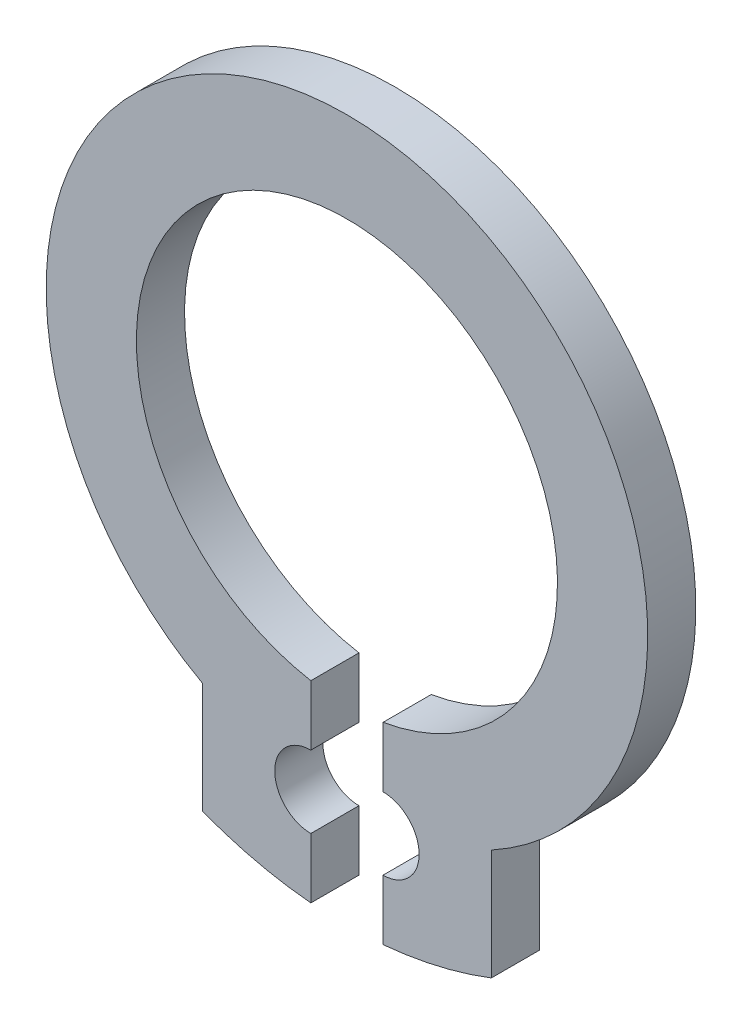
ISO-10303-21;
HEADER;
FILE_DESCRIPTION(('STEP AP214'),'2;1');
FILE_NAME('part.step','',(''),(''),'','','');
FILE_SCHEMA(('AUTOMOTIVE_DESIGN { 1 0 10303 214 1 1 1 1 }'));
ENDSEC;
DATA;
#1=APPLICATION_CONTEXT('core data for automotive mechanical design processes');
#2=APPLICATION_PROTOCOL_DEFINITION('international standard','automotive_design',2000,#1);
#3=PRODUCT_CONTEXT('',#1,'mechanical');
#4=PRODUCT('Part','Part','',(#3));
#5=PRODUCT_RELATED_PRODUCT_CATEGORY('part','',(#4));
#6=PRODUCT_DEFINITION_FORMATION('','',#4);
#7=PRODUCT_DEFINITION_CONTEXT('part definition',#1,'design');
#8=PRODUCT_DEFINITION('design','',#6,#7);
#9=PRODUCT_DEFINITION_SHAPE('','',#8);
#10=(LENGTH_UNIT() NAMED_UNIT(*) SI_UNIT(.MILLI.,.METRE.));
#11=(NAMED_UNIT(*) PLANE_ANGLE_UNIT() SI_UNIT($,.RADIAN.));
#12=(NAMED_UNIT(*) SI_UNIT($,.STERADIAN.) SOLID_ANGLE_UNIT());
#13=UNCERTAINTY_MEASURE_WITH_UNIT(LENGTH_MEASURE(1.E-05),#10,'distance_accuracy_value','');
#14=(GEOMETRIC_REPRESENTATION_CONTEXT(3) GLOBAL_UNCERTAINTY_ASSIGNED_CONTEXT((#13)) GLOBAL_UNIT_ASSIGNED_CONTEXT((#10,
#11,#12)) REPRESENTATION_CONTEXT('',''));
#15=CARTESIAN_POINT('',(0.,0.,0.));
#16=DIRECTION('',(0.,0.,1.));
#17=DIRECTION('',(1.,0.,0.));
#18=AXIS2_PLACEMENT_3D('',#15,#16,#17);
#19=CARTESIAN_POINT('',(0.,0.,0.8));
#20=DIRECTION('',(0.,0.,1.));
#21=DIRECTION('',(1.,0.,0.));
#22=AXIS2_PLACEMENT_3D('',#19,#20,#21);
#23=PLANE('',#22);
#24=DIRECTION('',(0.,1.,0.));
#25=VECTOR('',#24,1.);
#26=CARTESIAN_POINT('',(-1.2,0.,0.8));
#27=LINE('',#26,#25);
#28=CARTESIAN_POINT('',(-1.20000000000002,3.19999999999967,0.8));
#29=VERTEX_POINT('',#28);
#30=CARTESIAN_POINT('',(-1.2,2.2,0.8));
#31=VERTEX_POINT('',#30);
#32=EDGE_CURVE('E129',#29,#31,#27,.F.);
#33=ORIENTED_EDGE('',*,*,#32,.F.);
#34=CARTESIAN_POINT('',(-0.6,6.648187929913,0.8));
#35=DIRECTION('',(0.,0.,1.));
#36=DIRECTION('',(1.,0.,0.));
#37=AXIS2_PLACEMENT_3D('',#34,#35,#36);
#38=CIRCLE('',#37,3.5);
#39=CARTESIAN_POINT('',(0.,3.19999999999967,0.8));
#40=VERTEX_POINT('',#39);
#41=EDGE_CURVE('E116',#29,#40,#38,.F.);
#42=ORIENTED_EDGE('',*,*,#41,.T.);
#43=DIRECTION('',(0.,1.,0.));
#44=VECTOR('',#43,1.);
#45=CARTESIAN_POINT('',(0.,3.2,0.8));
#46=LINE('',#45,#44);
#47=CARTESIAN_POINT('',(0.,2.2,0.8));
#48=VERTEX_POINT('',#47);
#49=EDGE_CURVE('E114',#48,#40,#46,.T.);
#50=ORIENTED_EDGE('',*,*,#49,.F.);
#51=CARTESIAN_POINT('',(0.,1.6,0.8));
#52=DIRECTION('',(0.,0.,1.));
#53=DIRECTION('',(1.,0.,0.));
#54=AXIS2_PLACEMENT_3D('',#51,#52,#53);
#55=CIRCLE('',#54,0.6);
#56=CARTESIAN_POINT('',(0.,1.,0.8));
#57=VERTEX_POINT('',#56);
#58=EDGE_CURVE('E20',#48,#57,#55,.F.);
#59=ORIENTED_EDGE('',*,*,#58,.T.);
#60=DIRECTION('',(0.,1.,0.));
#61=VECTOR('',#60,1.);
#62=CARTESIAN_POINT('',(0.,3.2,0.8));
#63=LINE('',#62,#61);
#64=CARTESIAN_POINT('',(0.,1.11022302462516E-13,0.8));
#65=VERTEX_POINT('',#64);
#66=EDGE_CURVE('E101',#65,#57,#63,.T.);
#67=ORIENTED_EDGE('',*,*,#66,.F.);
#68=CARTESIAN_POINT('',(-0.6,6.648187929913,0.8));
#69=DIRECTION('',(0.,0.,1.));
#70=DIRECTION('',(1.,0.,0.));
#71=AXIS2_PLACEMENT_3D('',#68,#69,#70);
#72=CIRCLE('',#71,6.675208068026);
#73=CARTESIAN_POINT('',(1.8,0.419351541674828,0.8));
#74=VERTEX_POINT('',#73);
#75=EDGE_CURVE('E173',#74,#65,#72,.F.);
#76=ORIENTED_EDGE('',*,*,#75,.F.);
#77=DIRECTION('',(0.,1.,0.));
#78=VECTOR('',#77,1.);
#79=CARTESIAN_POINT('',(1.8,0.4193515416747,0.8));
#80=LINE('',#79,#78);
#81=CARTESIAN_POINT('',(1.80000000000003,2.26184549002075,0.8));
#82=VERTEX_POINT('',#81);
#83=EDGE_CURVE('E142',#82,#74,#80,.F.);
#84=ORIENTED_EDGE('',*,*,#83,.F.);
#85=CARTESIAN_POINT('',(-0.6,6.648187929913,0.8));
#86=DIRECTION('',(0.,0.,1.));
#87=DIRECTION('',(1.,0.,0.));
#88=AXIS2_PLACEMENT_3D('',#85,#86,#87);
#89=CIRCLE('',#88,5.);
#90=CARTESIAN_POINT('',(-3.,2.2618454900208,0.8));
#91=VERTEX_POINT('',#90);
#92=EDGE_CURVE('E172',#91,#82,#89,.F.);
#93=ORIENTED_EDGE('',*,*,#92,.F.);
#94=DIRECTION('',(0.,1.,0.));
#95=VECTOR('',#94,1.);
#96=CARTESIAN_POINT('',(-3.,2.261845490021,0.8));
#97=LINE('',#96,#95);
#98=CARTESIAN_POINT('',(-2.99999999999999,0.419351541674867,0.8));
#99=VERTEX_POINT('',#98);
#100=EDGE_CURVE('E137',#99,#91,#97,.T.);
#101=ORIENTED_EDGE('',*,*,#100,.F.);
#102=CARTESIAN_POINT('',(-0.6,6.648187929913,0.8));
#103=DIRECTION('',(0.,0.,1.));
#104=DIRECTION('',(1.,0.,0.));
#105=AXIS2_PLACEMENT_3D('',#102,#103,#104);
#106=CIRCLE('',#105,6.675208068026);
#107=CARTESIAN_POINT('',(-1.2,0.,0.8));
#108=VERTEX_POINT('',#107);
#109=EDGE_CURVE('E136',#108,#99,#106,.F.);
#110=ORIENTED_EDGE('',*,*,#109,.F.);
#111=DIRECTION('',(0.,1.,0.));
#112=VECTOR('',#111,1.);
#113=CARTESIAN_POINT('',(-1.2,0.,0.8));
#114=LINE('',#113,#112);
#115=CARTESIAN_POINT('',(-1.2,1.,0.8));
#116=VERTEX_POINT('',#115);
#117=EDGE_CURVE('E133',#116,#108,#114,.F.);
#118=ORIENTED_EDGE('',*,*,#117,.F.);
#119=CARTESIAN_POINT('',(-1.2,1.6,0.8));
#120=DIRECTION('',(0.,0.,1.));
#121=DIRECTION('',(1.,0.,0.));
#122=AXIS2_PLACEMENT_3D('',#119,#120,#121);
#123=CIRCLE('',#122,0.6);
#124=EDGE_CURVE('E132',#116,#31,#123,.F.);
#125=ORIENTED_EDGE('',*,*,#124,.T.);
#126=EDGE_LOOP('',(#33,#42,#50,#59,#67,#76,#84,#93,#101,#110,#118,#125));
#127=FACE_BOUND('',#126,.T.);
#128=ADVANCED_FACE('F17',(#127),#23,.T.);
#129=CARTESIAN_POINT('',(0.,3.2,0.));
#130=DIRECTION('',(-1.,0.,0.));
#131=DIRECTION('',(0.,0.,1.));
#132=AXIS2_PLACEMENT_3D('',#129,#130,#131);
#133=PLANE('',#132);
#134=ORIENTED_EDGE('',*,*,#49,.T.);
#135=DIRECTION('',(0.,0.,1.));
#136=VECTOR('',#135,1.);
#137=CARTESIAN_POINT('',(0.,3.19999999999967,0.));
#138=LINE('',#137,#136);
#139=CARTESIAN_POINT('',(0.,3.19999999999967,0.));
#140=VERTEX_POINT('',#139);
#141=EDGE_CURVE('E166',#40,#140,#138,.F.);
#142=ORIENTED_EDGE('',*,*,#141,.T.);
#143=DIRECTION('',(0.,1.,0.));
#144=VECTOR('',#143,1.);
#145=CARTESIAN_POINT('',(0.,0.,0.));
#146=LINE('',#145,#144);
#147=CARTESIAN_POINT('',(0.,2.2,0.));
#148=VERTEX_POINT('',#147);
#149=EDGE_CURVE('E124',#140,#148,#146,.F.);
#150=ORIENTED_EDGE('',*,*,#149,.T.);
#151=DIRECTION('',(0.,0.,1.));
#152=VECTOR('',#151,1.);
#153=CARTESIAN_POINT('',(0.,2.2,-0.08));
#154=LINE('',#153,#152);
#155=EDGE_CURVE('E109',#148,#48,#154,.T.);
#156=ORIENTED_EDGE('',*,*,#155,.T.);
#157=EDGE_LOOP('',(#134,#142,#150,#156));
#158=FACE_BOUND('',#157,.T.);
#159=ADVANCED_FACE('F122',(#158),#133,.T.);
#160=CARTESIAN_POINT('',(0.,1.6,-0.08));
#161=DIRECTION('',(0.,0.,1.));
#162=DIRECTION('',(1.,0.,0.));
#163=AXIS2_PLACEMENT_3D('',#160,#161,#162);
#164=CYLINDRICAL_SURFACE('',#163,0.6);
#165=CARTESIAN_POINT('',(0.,1.6,0.));
#166=DIRECTION('',(0.,0.,1.));
#167=DIRECTION('',(1.,0.,0.));
#168=AXIS2_PLACEMENT_3D('',#165,#166,#167);
#169=CIRCLE('',#168,0.6);
#170=CARTESIAN_POINT('',(0.,1.,0.));
#171=VERTEX_POINT('',#170);
#172=EDGE_CURVE('E163',#148,#171,#169,.F.);
#173=ORIENTED_EDGE('',*,*,#172,.T.);
#174=DIRECTION('',(0.,0.,1.));
#175=VECTOR('',#174,1.);
#176=CARTESIAN_POINT('',(0.,1.,0.));
#177=LINE('',#176,#175);
#178=EDGE_CURVE('E111',#57,#171,#177,.F.);
#179=ORIENTED_EDGE('',*,*,#178,.F.);
#180=ORIENTED_EDGE('',*,*,#58,.F.);
#181=ORIENTED_EDGE('',*,*,#155,.F.);
#182=EDGE_LOOP('',(#173,#179,#180,#181));
#183=FACE_BOUND('',#182,.T.);
#184=ADVANCED_FACE('F107',(#183),#164,.F.);
#185=CARTESIAN_POINT('',(0.,3.2,0.));
#186=DIRECTION('',(-1.,0.,0.));
#187=DIRECTION('',(0.,0.,1.));
#188=AXIS2_PLACEMENT_3D('',#185,#186,#187);
#189=PLANE('',#188);
#190=DIRECTION('',(0.,1.,0.));
#191=VECTOR('',#190,1.);
#192=CARTESIAN_POINT('',(0.,0.,0.));
#193=LINE('',#192,#191);
#194=CARTESIAN_POINT('',(0.,1.11022302462516E-13,0.));
#195=VERTEX_POINT('',#194);
#196=EDGE_CURVE('E162',#171,#195,#193,.F.);
#197=ORIENTED_EDGE('',*,*,#196,.T.);
#198=DIRECTION('',(0.,0.,1.));
#199=VECTOR('',#198,1.);
#200=CARTESIAN_POINT('',(0.,1.11022302462516E-13,0.));
#201=LINE('',#200,#199);
#202=EDGE_CURVE('E175',#65,#195,#201,.F.);
#203=ORIENTED_EDGE('',*,*,#202,.F.);
#204=ORIENTED_EDGE('',*,*,#66,.T.);
#205=ORIENTED_EDGE('',*,*,#178,.T.);
#206=EDGE_LOOP('',(#197,#203,#204,#205));
#207=FACE_BOUND('',#206,.T.);
#208=ADVANCED_FACE('F233',(#207),#189,.T.);
#209=CARTESIAN_POINT('',(-0.6,6.648187929913,0.));
#210=DIRECTION('',(0.,0.,1.));
#211=DIRECTION('',(1.,0.,0.));
#212=AXIS2_PLACEMENT_3D('',#209,#210,#211);
#213=CYLINDRICAL_SURFACE('',#212,6.675208068026);
#214=DIRECTION('',(0.,0.,-1.));
#215=VECTOR('',#214,1.);
#216=CARTESIAN_POINT('',(1.8,0.419351541674785,0.));
#217=LINE('',#216,#215);
#218=CARTESIAN_POINT('',(1.8,0.419351541674829,0.));
#219=VERTEX_POINT('',#218);
#220=EDGE_CURVE('E146',#74,#219,#217,.T.);
#221=ORIENTED_EDGE('',*,*,#220,.F.);
#222=ORIENTED_EDGE('',*,*,#75,.T.);
#223=ORIENTED_EDGE('',*,*,#202,.T.);
#224=CARTESIAN_POINT('',(-0.6,6.648187929913,0.));
#225=DIRECTION('',(0.,0.,1.));
#226=DIRECTION('',(1.,0.,0.));
#227=AXIS2_PLACEMENT_3D('',#224,#225,#226);
#228=CIRCLE('',#227,6.675208068026);
#229=EDGE_CURVE('E159',#195,#219,#228,.T.);
#230=ORIENTED_EDGE('',*,*,#229,.T.);
#231=EDGE_LOOP('',(#221,#222,#223,#230));
#232=FACE_BOUND('',#231,.T.);
#233=ADVANCED_FACE('F231',(#232),#213,.T.);
#234=CARTESIAN_POINT('',(1.8,0.4193515416747,0.));
#235=DIRECTION('',(1.,0.,0.));
#236=DIRECTION('',(0.,0.,-1.));
#237=AXIS2_PLACEMENT_3D('',#234,#235,#236);
#238=PLANE('',#237);
#239=DIRECTION('',(0.,0.,1.));
#240=VECTOR('',#239,1.);
#241=CARTESIAN_POINT('',(1.80000000000006,2.26184549002077,0.));
#242=LINE('',#241,#240);
#243=CARTESIAN_POINT('',(1.80000000000003,2.26184549002075,0.));
#244=VERTEX_POINT('',#243);
#245=EDGE_CURVE('E145',#82,#244,#242,.F.);
#246=ORIENTED_EDGE('',*,*,#245,.F.);
#247=ORIENTED_EDGE('',*,*,#83,.T.);
#248=ORIENTED_EDGE('',*,*,#220,.T.);
#249=DIRECTION('',(0.,1.,0.));
#250=VECTOR('',#249,1.);
#251=CARTESIAN_POINT('',(1.8,0.,0.));
#252=LINE('',#251,#250);
#253=EDGE_CURVE('E158',#219,#244,#252,.T.);
#254=ORIENTED_EDGE('',*,*,#253,.T.);
#255=EDGE_LOOP('',(#246,#247,#248,#254));
#256=FACE_BOUND('',#255,.T.);
#257=ADVANCED_FACE('F229',(#256),#238,.T.);
#258=CARTESIAN_POINT('',(-0.6,6.648187929913,0.));
#259=DIRECTION('',(0.,0.,1.));
#260=DIRECTION('',(1.,0.,0.));
#261=AXIS2_PLACEMENT_3D('',#258,#259,#260);
#262=CYLINDRICAL_SURFACE('',#261,5.);
#263=DIRECTION('',(0.,0.,1.));
#264=VECTOR('',#263,1.);
#265=CARTESIAN_POINT('',(-3.,2.26184549002087,0.));
#266=LINE('',#265,#264);
#267=CARTESIAN_POINT('',(-3.,2.2618454900208,0.));
#268=VERTEX_POINT('',#267);
#269=EDGE_CURVE('E141',#91,#268,#266,.F.);
#270=ORIENTED_EDGE('',*,*,#269,.F.);
#271=ORIENTED_EDGE('',*,*,#92,.T.);
#272=ORIENTED_EDGE('',*,*,#245,.T.);
#273=CARTESIAN_POINT('',(-0.6,6.648187929913,0.));
#274=DIRECTION('',(0.,0.,1.));
#275=DIRECTION('',(1.,0.,0.));
#276=AXIS2_PLACEMENT_3D('',#273,#274,#275);
#277=CIRCLE('',#276,5.);
#278=EDGE_CURVE('E156',#244,#268,#277,.T.);
#279=ORIENTED_EDGE('',*,*,#278,.T.);
#280=EDGE_LOOP('',(#270,#271,#272,#279));
#281=FACE_BOUND('',#280,.T.);
#282=ADVANCED_FACE('F261',(#281),#262,.T.);
#283=CARTESIAN_POINT('',(-3.,2.261845490021,0.));
#284=DIRECTION('',(-1.,0.,0.));
#285=DIRECTION('',(0.,0.,1.));
#286=AXIS2_PLACEMENT_3D('',#283,#284,#285);
#287=PLANE('',#286);
#288=DIRECTION('',(0.,0.,1.));
#289=VECTOR('',#288,1.);
#290=CARTESIAN_POINT('',(-2.99999999999998,0.419351541674862,0.));
#291=LINE('',#290,#289);
#292=CARTESIAN_POINT('',(-2.99999999999999,0.419351541674867,0.));
#293=VERTEX_POINT('',#292);
#294=EDGE_CURVE('E140',#99,#293,#291,.F.);
#295=ORIENTED_EDGE('',*,*,#294,.F.);
#296=ORIENTED_EDGE('',*,*,#100,.T.);
#297=ORIENTED_EDGE('',*,*,#269,.T.);
#298=DIRECTION('',(0.,1.,0.));
#299=VECTOR('',#298,1.);
#300=CARTESIAN_POINT('',(-3.,0.,0.));
#301=LINE('',#300,#299);
#302=EDGE_CURVE('E155',#268,#293,#301,.F.);
#303=ORIENTED_EDGE('',*,*,#302,.T.);
#304=EDGE_LOOP('',(#295,#296,#297,#303));
#305=FACE_BOUND('',#304,.T.);
#306=ADVANCED_FACE('F222',(#305),#287,.T.);
#307=CARTESIAN_POINT('',(-0.6,6.648187929913,0.));
#308=DIRECTION('',(0.,0.,1.));
#309=DIRECTION('',(1.,0.,0.));
#310=AXIS2_PLACEMENT_3D('',#307,#308,#309);
#311=CYLINDRICAL_SURFACE('',#310,6.675208068026);
#312=DIRECTION('',(0.,0.,-1.));
#313=VECTOR('',#312,1.);
#314=CARTESIAN_POINT('',(-1.2,0.,0.));
#315=LINE('',#314,#313);
#316=CARTESIAN_POINT('',(-1.2,0.,0.));
#317=VERTEX_POINT('',#316);
#318=EDGE_CURVE('E135',#108,#317,#315,.T.);
#319=ORIENTED_EDGE('',*,*,#318,.F.);
#320=ORIENTED_EDGE('',*,*,#109,.T.);
#321=ORIENTED_EDGE('',*,*,#294,.T.);
#322=CARTESIAN_POINT('',(-0.6,6.648187929913,0.));
#323=DIRECTION('',(0.,0.,1.));
#324=DIRECTION('',(1.,0.,0.));
#325=AXIS2_PLACEMENT_3D('',#322,#323,#324);
#326=CIRCLE('',#325,6.675208068026);
#327=EDGE_CURVE('E152',#293,#317,#326,.T.);
#328=ORIENTED_EDGE('',*,*,#327,.T.);
#329=EDGE_LOOP('',(#319,#320,#321,#328));
#330=FACE_BOUND('',#329,.T.);
#331=ADVANCED_FACE('F219',(#330),#311,.T.);
#332=CARTESIAN_POINT('',(-1.2,0.,0.));
#333=DIRECTION('',(1.,0.,0.));
#334=DIRECTION('',(0.,0.,-1.));
#335=AXIS2_PLACEMENT_3D('',#332,#333,#334);
#336=PLANE('',#335);
#337=ORIENTED_EDGE('',*,*,#117,.T.);
#338=ORIENTED_EDGE('',*,*,#318,.T.);
#339=DIRECTION('',(0.,1.,0.));
#340=VECTOR('',#339,1.);
#341=CARTESIAN_POINT('',(-1.2,0.,0.));
#342=LINE('',#341,#340);
#343=CARTESIAN_POINT('',(-1.2,1.,0.));
#344=VERTEX_POINT('',#343);
#345=EDGE_CURVE('E151',#317,#344,#342,.T.);
#346=ORIENTED_EDGE('',*,*,#345,.T.);
#347=DIRECTION('',(0.,0.,1.));
#348=VECTOR('',#347,1.);
#349=CARTESIAN_POINT('',(-1.2,1.,-0.08));
#350=LINE('',#349,#348);
#351=EDGE_CURVE('E169',#344,#116,#350,.T.);
#352=ORIENTED_EDGE('',*,*,#351,.T.);
#353=EDGE_LOOP('',(#337,#338,#346,#352));
#354=FACE_BOUND('',#353,.T.);
#355=ADVANCED_FACE('F213',(#354),#336,.T.);
#356=CARTESIAN_POINT('',(-1.2,1.6,-0.08));
#357=DIRECTION('',(0.,0.,1.));
#358=DIRECTION('',(1.,0.,0.));
#359=AXIS2_PLACEMENT_3D('',#356,#357,#358);
#360=CYLINDRICAL_SURFACE('',#359,0.6);
#361=ORIENTED_EDGE('',*,*,#351,.F.);
#362=CARTESIAN_POINT('',(-1.2,1.6,0.));
#363=DIRECTION('',(0.,0.,1.));
#364=DIRECTION('',(1.,0.,0.));
#365=AXIS2_PLACEMENT_3D('',#362,#363,#364);
#366=CIRCLE('',#365,0.6);
#367=CARTESIAN_POINT('',(-1.2,2.2,0.));
#368=VERTEX_POINT('',#367);
#369=EDGE_CURVE('E148',#344,#368,#366,.F.);
#370=ORIENTED_EDGE('',*,*,#369,.T.);
#371=DIRECTION('',(0.,0.,-1.));
#372=VECTOR('',#371,1.);
#373=CARTESIAN_POINT('',(-1.2,2.2,0.));
#374=LINE('',#373,#372);
#375=EDGE_CURVE('E131',#31,#368,#374,.T.);
#376=ORIENTED_EDGE('',*,*,#375,.F.);
#377=ORIENTED_EDGE('',*,*,#124,.F.);
#378=EDGE_LOOP('',(#361,#370,#376,#377));
#379=FACE_BOUND('',#378,.T.);
#380=ADVANCED_FACE('F210',(#379),#360,.F.);
#381=CARTESIAN_POINT('',(-1.2,0.,0.));
#382=DIRECTION('',(1.,0.,0.));
#383=DIRECTION('',(0.,0.,-1.));
#384=AXIS2_PLACEMENT_3D('',#381,#382,#383);
#385=PLANE('',#384);
#386=DIRECTION('',(0.,1.,0.));
#387=VECTOR('',#386,1.);
#388=CARTESIAN_POINT('',(-1.2,0.,0.));
#389=LINE('',#388,#387);
#390=CARTESIAN_POINT('',(-1.20000000000002,3.19999999999967,0.));
#391=VERTEX_POINT('',#390);
#392=EDGE_CURVE('E26',#368,#391,#389,.T.);
#393=ORIENTED_EDGE('',*,*,#392,.T.);
#394=DIRECTION('',(0.,0.,1.));
#395=VECTOR('',#394,1.);
#396=CARTESIAN_POINT('',(-1.20000000000003,3.19999999999967,0.));
#397=LINE('',#396,#395);
#398=EDGE_CURVE('E34',#391,#29,#397,.T.);
#399=ORIENTED_EDGE('',*,*,#398,.T.);
#400=ORIENTED_EDGE('',*,*,#32,.T.);
#401=ORIENTED_EDGE('',*,*,#375,.T.);
#402=EDGE_LOOP('',(#393,#399,#400,#401));
#403=FACE_BOUND('',#402,.T.);
#404=ADVANCED_FACE('F203',(#403),#385,.T.);
#405=CARTESIAN_POINT('',(-0.6,6.648187929913,0.));
#406=DIRECTION('',(0.,0.,1.));
#407=DIRECTION('',(1.,0.,0.));
#408=AXIS2_PLACEMENT_3D('',#405,#406,#407);
#409=CYLINDRICAL_SURFACE('',#408,3.5);
#410=CARTESIAN_POINT('',(-0.6,6.648187929913,0.));
#411=DIRECTION('',(0.,0.,1.));
#412=DIRECTION('',(1.,0.,0.));
#413=AXIS2_PLACEMENT_3D('',#410,#411,#412);
#414=CIRCLE('',#413,3.5);
#415=EDGE_CURVE('E11',#391,#140,#414,.F.);
#416=ORIENTED_EDGE('',*,*,#415,.T.);
#417=ORIENTED_EDGE('',*,*,#141,.F.);
#418=ORIENTED_EDGE('',*,*,#41,.F.);
#419=ORIENTED_EDGE('',*,*,#398,.F.);
#420=EDGE_LOOP('',(#416,#417,#418,#419));
#421=FACE_BOUND('',#420,.T.);
#422=ADVANCED_FACE('F244',(#421),#409,.F.);
#423=CARTESIAN_POINT('',(0.,0.,0.));
#424=DIRECTION('',(0.,0.,1.));
#425=DIRECTION('',(1.,0.,0.));
#426=AXIS2_PLACEMENT_3D('',#423,#424,#425);
#427=PLANE('',#426);
#428=ORIENTED_EDGE('',*,*,#149,.F.);
#429=ORIENTED_EDGE('',*,*,#415,.F.);
#430=ORIENTED_EDGE('',*,*,#392,.F.);
#431=ORIENTED_EDGE('',*,*,#369,.F.);
#432=ORIENTED_EDGE('',*,*,#345,.F.);
#433=ORIENTED_EDGE('',*,*,#327,.F.);
#434=ORIENTED_EDGE('',*,*,#302,.F.);
#435=ORIENTED_EDGE('',*,*,#278,.F.);
#436=ORIENTED_EDGE('',*,*,#253,.F.);
#437=ORIENTED_EDGE('',*,*,#229,.F.);
#438=ORIENTED_EDGE('',*,*,#196,.F.);
#439=ORIENTED_EDGE('',*,*,#172,.F.);
#440=EDGE_LOOP('',(#428,#429,#430,#431,#432,#433,#434,#435,#436,#437,#438,#439));
#441=FACE_BOUND('',#440,.T.);
#442=ADVANCED_FACE('F207',(#441),#427,.F.);
#443=CLOSED_SHELL('',(#128,#159,#184,#208,#233,#257,#282,#306,#331,#355,#380,#404,#422,#442));
#444=MANIFOLD_SOLID_BREP('B1',#443);
#445=ADVANCED_BREP_SHAPE_REPRESENTATION('',(#18,#444),#14);
#446=SHAPE_DEFINITION_REPRESENTATION(#9,#445);
ENDSEC;
END-ISO-10303-21;
